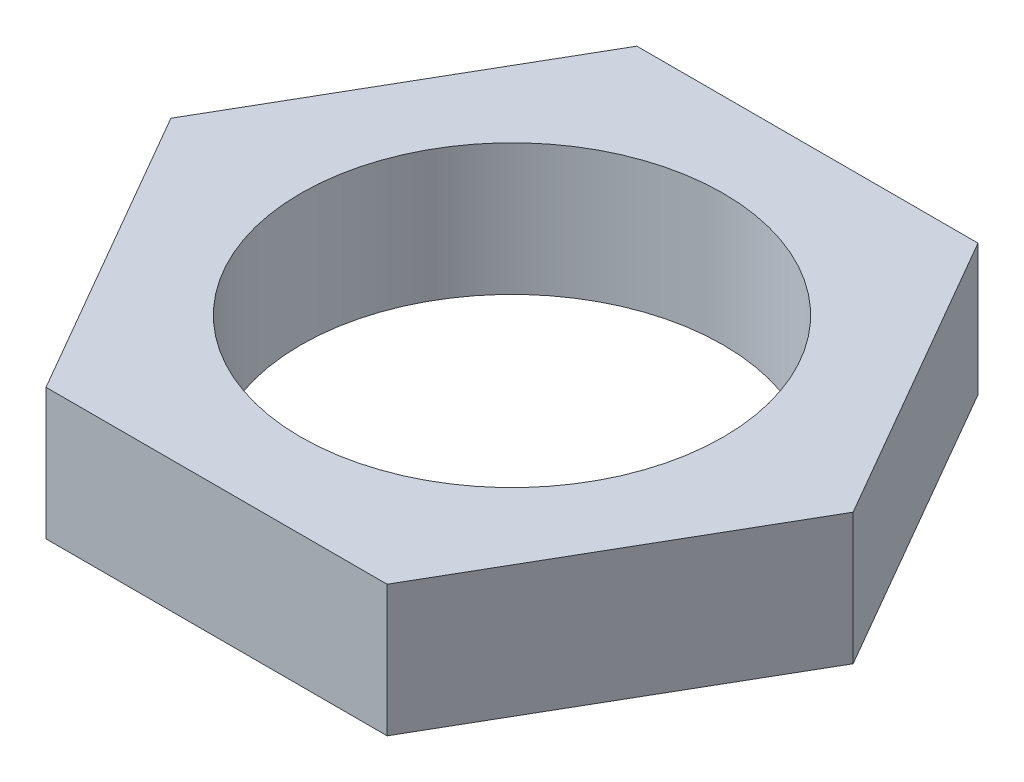
ISO-10303-21;
HEADER;
FILE_DESCRIPTION(('STEP AP214'),'2;1');
FILE_NAME('part.step','',(''),(''),'','','');
FILE_SCHEMA(('AUTOMOTIVE_DESIGN { 1 0 10303 214 1 1 1 1 }'));
ENDSEC;
DATA;
#1=APPLICATION_CONTEXT('core data for automotive mechanical design processes');
#2=APPLICATION_PROTOCOL_DEFINITION('international standard','automotive_design',2000,#1);
#3=PRODUCT_CONTEXT('',#1,'mechanical');
#4=PRODUCT('Part','Part','',(#3));
#5=PRODUCT_RELATED_PRODUCT_CATEGORY('part','',(#4));
#6=PRODUCT_DEFINITION_FORMATION('','',#4);
#7=PRODUCT_DEFINITION_CONTEXT('part definition',#1,'design');
#8=PRODUCT_DEFINITION('design','',#6,#7);
#9=PRODUCT_DEFINITION_SHAPE('','',#8);
#10=(LENGTH_UNIT() NAMED_UNIT(*) SI_UNIT(.MILLI.,.METRE.));
#11=(NAMED_UNIT(*) PLANE_ANGLE_UNIT() SI_UNIT($,.RADIAN.));
#12=(NAMED_UNIT(*) SI_UNIT($,.STERADIAN.) SOLID_ANGLE_UNIT());
#13=UNCERTAINTY_MEASURE_WITH_UNIT(LENGTH_MEASURE(1.E-05),#10,'distance_accuracy_value','');
#14=(GEOMETRIC_REPRESENTATION_CONTEXT(3) GLOBAL_UNCERTAINTY_ASSIGNED_CONTEXT((#13)) GLOBAL_UNIT_ASSIGNED_CONTEXT((#10,
#11,#12)) REPRESENTATION_CONTEXT('',''));
#15=CARTESIAN_POINT('',(0.,0.,0.));
#16=DIRECTION('',(0.,0.,1.));
#17=DIRECTION('',(1.,0.,0.));
#18=AXIS2_PLACEMENT_3D('',#15,#16,#17);
#19=CARTESIAN_POINT('',(7.79422863405994,6.,13.5));
#20=DIRECTION('',(0.,1.,0.));
#21=DIRECTION('',(0.,0.,1.));
#22=AXIS2_PLACEMENT_3D('',#19,#20,#21);
#23=PLANE('',#22);
#24=DIRECTION('',(1.,0.,0.));
#25=VECTOR('',#24,1.);
#26=CARTESIAN_POINT('',(-7.79422863405994,6.,13.5));
#27=LINE('',#26,#25);
#28=CARTESIAN_POINT('',(-7.79422863405994,6.,13.5));
#29=VERTEX_POINT('',#28);
#30=CARTESIAN_POINT('',(7.79422863405994,6.,13.5));
#31=VERTEX_POINT('',#30);
#32=EDGE_CURVE('E127',#29,#31,#27,.T.);
#33=ORIENTED_EDGE('',*,*,#32,.T.);
#34=DIRECTION('',(0.5,0.,-0.866025403784439));
#35=VECTOR('',#34,1.);
#36=CARTESIAN_POINT('',(7.79422863405994,6.,13.5));
#37=LINE('',#36,#35);
#38=CARTESIAN_POINT('',(15.5884572681199,6.,0.));
#39=VERTEX_POINT('',#38);
#40=EDGE_CURVE('E85',#31,#39,#37,.T.);
#41=ORIENTED_EDGE('',*,*,#40,.T.);
#42=DIRECTION('',(-0.5,0.,-0.866025403784439));
#43=VECTOR('',#42,1.);
#44=CARTESIAN_POINT('',(15.5884572681199,6.,0.));
#45=LINE('',#44,#43);
#46=CARTESIAN_POINT('',(7.79422863405994,6.,-13.5));
#47=VERTEX_POINT('',#46);
#48=EDGE_CURVE('E98',#39,#47,#45,.T.);
#49=ORIENTED_EDGE('',*,*,#48,.T.);
#50=DIRECTION('',(-1.,0.,0.));
#51=VECTOR('',#50,1.);
#52=CARTESIAN_POINT('',(7.79422863405994,6.,-13.5));
#53=LINE('',#52,#51);
#54=CARTESIAN_POINT('',(-7.79422863405995,6.,-13.5));
#55=VERTEX_POINT('',#54);
#56=EDGE_CURVE('E92',#47,#55,#53,.T.);
#57=ORIENTED_EDGE('',*,*,#56,.T.);
#58=DIRECTION('',(-0.5,0.,0.866025403784439));
#59=VECTOR('',#58,1.);
#60=CARTESIAN_POINT('',(-7.79422863405995,6.,-13.5));
#61=LINE('',#60,#59);
#62=CARTESIAN_POINT('',(-15.5884572681199,6.,0.));
#63=VERTEX_POINT('',#62);
#64=EDGE_CURVE('E96',#55,#63,#61,.T.);
#65=ORIENTED_EDGE('',*,*,#64,.T.);
#66=DIRECTION('',(0.5,0.,0.866025403784439));
#67=VECTOR('',#66,1.);
#68=CARTESIAN_POINT('',(-15.5884572681199,6.,0.));
#69=LINE('',#68,#67);
#70=EDGE_CURVE('E48',#63,#29,#69,.T.);
#71=ORIENTED_EDGE('',*,*,#70,.T.);
#72=EDGE_LOOP('',(#33,#41,#49,#57,#65,#71));
#73=FACE_BOUND('',#72,.T.);
#74=CARTESIAN_POINT('',(0.,6.,0.));
#75=DIRECTION('',(0.,1.,0.));
#76=DIRECTION('',(0.,0.,1.));
#77=AXIS2_PLACEMENT_3D('',#74,#75,#76);
#78=CIRCLE('',#77,9.65);
#79=CARTESIAN_POINT('',(0.,6.,9.65));
#80=VERTEX_POINT('',#79);
#81=EDGE_CURVE('E120',#80,#80,#78,.T.);
#82=ORIENTED_EDGE('',*,*,#81,.F.);
#83=EDGE_LOOP('',(#82));
#84=FACE_BOUND('',#83,.T.);
#85=ADVANCED_FACE('F31',(#73,#84),#23,.T.);
#86=CARTESIAN_POINT('',(7.79422863405994,0.,13.5));
#87=DIRECTION('',(0.,1.,0.));
#88=DIRECTION('',(0.,0.,1.));
#89=AXIS2_PLACEMENT_3D('',#86,#87,#88);
#90=PLANE('',#89);
#91=DIRECTION('',(1.,0.,0.));
#92=VECTOR('',#91,1.);
#93=CARTESIAN_POINT('',(-7.79422863405994,0.,13.5));
#94=LINE('',#93,#92);
#95=CARTESIAN_POINT('',(-7.79422863405994,0.,13.5));
#96=VERTEX_POINT('',#95);
#97=CARTESIAN_POINT('',(7.79422863405994,0.,13.5));
#98=VERTEX_POINT('',#97);
#99=EDGE_CURVE('E116',#96,#98,#94,.T.);
#100=ORIENTED_EDGE('',*,*,#99,.F.);
#101=DIRECTION('',(0.5,0.,0.866025403784439));
#102=VECTOR('',#101,1.);
#103=CARTESIAN_POINT('',(-15.5884572681199,0.,0.));
#104=LINE('',#103,#102);
#105=CARTESIAN_POINT('',(-15.5884572681199,0.,0.));
#106=VERTEX_POINT('',#105);
#107=EDGE_CURVE('E77',#106,#96,#104,.T.);
#108=ORIENTED_EDGE('',*,*,#107,.F.);
#109=DIRECTION('',(-0.5,0.,0.866025403784439));
#110=VECTOR('',#109,1.);
#111=CARTESIAN_POINT('',(-7.79422863405995,0.,-13.5));
#112=LINE('',#111,#110);
#113=CARTESIAN_POINT('',(-7.79422863405995,0.,-13.5));
#114=VERTEX_POINT('',#113);
#115=EDGE_CURVE('E71',#114,#106,#112,.T.);
#116=ORIENTED_EDGE('',*,*,#115,.F.);
#117=DIRECTION('',(-1.,0.,0.));
#118=VECTOR('',#117,1.);
#119=CARTESIAN_POINT('',(7.79422863405994,0.,-13.5));
#120=LINE('',#119,#118);
#121=CARTESIAN_POINT('',(7.79422863405994,0.,-13.5));
#122=VERTEX_POINT('',#121);
#123=EDGE_CURVE('E106',#122,#114,#120,.T.);
#124=ORIENTED_EDGE('',*,*,#123,.F.);
#125=DIRECTION('',(-0.5,0.,-0.866025403784439));
#126=VECTOR('',#125,1.);
#127=CARTESIAN_POINT('',(15.5884572681199,0.,0.));
#128=LINE('',#127,#126);
#129=CARTESIAN_POINT('',(15.5884572681199,0.,0.));
#130=VERTEX_POINT('',#129);
#131=EDGE_CURVE('E122',#130,#122,#128,.T.);
#132=ORIENTED_EDGE('',*,*,#131,.F.);
#133=DIRECTION('',(0.5,0.,-0.866025403784439));
#134=VECTOR('',#133,1.);
#135=CARTESIAN_POINT('',(7.79422863405994,0.,13.5));
#136=LINE('',#135,#134);
#137=EDGE_CURVE('E119',#98,#130,#136,.T.);
#138=ORIENTED_EDGE('',*,*,#137,.F.);
#139=EDGE_LOOP('',(#100,#108,#116,#124,#132,#138));
#140=FACE_BOUND('',#139,.T.);
#141=CARTESIAN_POINT('',(0.,0.,0.));
#142=DIRECTION('',(0.,1.,0.));
#143=DIRECTION('',(0.,0.,1.));
#144=AXIS2_PLACEMENT_3D('',#141,#142,#143);
#145=CIRCLE('',#144,9.65);
#146=CARTESIAN_POINT('',(0.,0.,9.65));
#147=VERTEX_POINT('',#146);
#148=EDGE_CURVE('E220',#147,#147,#145,.T.);
#149=ORIENTED_EDGE('',*,*,#148,.T.);
#150=EDGE_LOOP('',(#149));
#151=FACE_BOUND('',#150,.T.);
#152=ADVANCED_FACE('F136',(#140,#151),#90,.F.);
#153=CARTESIAN_POINT('',(-7.79422863405994,6.,13.5));
#154=DIRECTION('',(0.,0.,-1.));
#155=DIRECTION('',(-1.,0.,0.));
#156=AXIS2_PLACEMENT_3D('',#153,#154,#155);
#157=PLANE('',#156);
#158=ORIENTED_EDGE('',*,*,#99,.T.);
#159=DIRECTION('',(0.,-1.,0.));
#160=VECTOR('',#159,1.);
#161=CARTESIAN_POINT('',(7.79422863405994,6.,13.5));
#162=LINE('',#161,#160);
#163=EDGE_CURVE('E11',#31,#98,#162,.T.);
#164=ORIENTED_EDGE('',*,*,#163,.F.);
#165=ORIENTED_EDGE('',*,*,#32,.F.);
#166=DIRECTION('',(0.,-1.,0.));
#167=VECTOR('',#166,1.);
#168=CARTESIAN_POINT('',(-7.79422863405994,6.,13.5));
#169=LINE('',#168,#167);
#170=EDGE_CURVE('E112',#29,#96,#169,.T.);
#171=ORIENTED_EDGE('',*,*,#170,.T.);
#172=EDGE_LOOP('',(#158,#164,#165,#171));
#173=FACE_BOUND('',#172,.T.);
#174=ADVANCED_FACE('F33',(#173),#157,.F.);
#175=CARTESIAN_POINT('',(7.79422863405994,6.,13.5));
#176=DIRECTION('',(-0.866025403784439,0.,-0.5));
#177=DIRECTION('',(-0.5,0.,0.866025403784439));
#178=AXIS2_PLACEMENT_3D('',#175,#176,#177);
#179=PLANE('',#178);
#180=ORIENTED_EDGE('',*,*,#137,.T.);
#181=DIRECTION('',(0.,-1.,0.));
#182=VECTOR('',#181,1.);
#183=CARTESIAN_POINT('',(15.5884572681199,6.,0.));
#184=LINE('',#183,#182);
#185=EDGE_CURVE('E40',#39,#130,#184,.T.);
#186=ORIENTED_EDGE('',*,*,#185,.F.);
#187=ORIENTED_EDGE('',*,*,#40,.F.);
#188=ORIENTED_EDGE('',*,*,#163,.T.);
#189=EDGE_LOOP('',(#180,#186,#187,#188));
#190=FACE_BOUND('',#189,.T.);
#191=ADVANCED_FACE('F161',(#190),#179,.F.);
#192=CARTESIAN_POINT('',(15.5884572681199,6.,0.));
#193=DIRECTION('',(-0.866025403784438,0.,0.5));
#194=DIRECTION('',(0.5,0.,0.866025403784439));
#195=AXIS2_PLACEMENT_3D('',#192,#193,#194);
#196=PLANE('',#195);
#197=ORIENTED_EDGE('',*,*,#131,.T.);
#198=DIRECTION('',(0.,-1.,0.));
#199=VECTOR('',#198,1.);
#200=CARTESIAN_POINT('',(7.79422863405994,6.,-13.5));
#201=LINE('',#200,#199);
#202=EDGE_CURVE('E107',#47,#122,#201,.T.);
#203=ORIENTED_EDGE('',*,*,#202,.F.);
#204=ORIENTED_EDGE('',*,*,#48,.F.);
#205=ORIENTED_EDGE('',*,*,#185,.T.);
#206=EDGE_LOOP('',(#197,#203,#204,#205));
#207=FACE_BOUND('',#206,.T.);
#208=ADVANCED_FACE('F133',(#207),#196,.F.);
#209=CARTESIAN_POINT('',(7.79422863405994,6.,-13.5));
#210=DIRECTION('',(0.,0.,1.));
#211=DIRECTION('',(1.,0.,0.));
#212=AXIS2_PLACEMENT_3D('',#209,#210,#211);
#213=PLANE('',#212);
#214=ORIENTED_EDGE('',*,*,#123,.T.);
#215=DIRECTION('',(0.,-1.,0.));
#216=VECTOR('',#215,1.);
#217=CARTESIAN_POINT('',(-7.79422863405995,6.,-13.5));
#218=LINE('',#217,#216);
#219=EDGE_CURVE('E103',#55,#114,#218,.T.);
#220=ORIENTED_EDGE('',*,*,#219,.F.);
#221=ORIENTED_EDGE('',*,*,#56,.F.);
#222=ORIENTED_EDGE('',*,*,#202,.T.);
#223=EDGE_LOOP('',(#214,#220,#221,#222));
#224=FACE_BOUND('',#223,.T.);
#225=ADVANCED_FACE('F104',(#224),#213,.F.);
#226=CARTESIAN_POINT('',(-7.79422863405995,6.,-13.5));
#227=DIRECTION('',(0.866025403784439,0.,0.5));
#228=DIRECTION('',(0.5,0.,-0.866025403784439));
#229=AXIS2_PLACEMENT_3D('',#226,#227,#228);
#230=PLANE('',#229);
#231=ORIENTED_EDGE('',*,*,#115,.T.);
#232=DIRECTION('',(0.,-1.,0.));
#233=VECTOR('',#232,1.);
#234=CARTESIAN_POINT('',(-15.5884572681199,6.,0.));
#235=LINE('',#234,#233);
#236=EDGE_CURVE('E108',#63,#106,#235,.T.);
#237=ORIENTED_EDGE('',*,*,#236,.F.);
#238=ORIENTED_EDGE('',*,*,#64,.F.);
#239=ORIENTED_EDGE('',*,*,#219,.T.);
#240=EDGE_LOOP('',(#231,#237,#238,#239));
#241=FACE_BOUND('',#240,.T.);
#242=ADVANCED_FACE('F110',(#241),#230,.F.);
#243=CARTESIAN_POINT('',(-15.5884572681199,6.,0.));
#244=DIRECTION('',(0.866025403784439,0.,-0.5));
#245=DIRECTION('',(-0.5,0.,-0.866025403784439));
#246=AXIS2_PLACEMENT_3D('',#243,#244,#245);
#247=PLANE('',#246);
#248=ORIENTED_EDGE('',*,*,#107,.T.);
#249=ORIENTED_EDGE('',*,*,#170,.F.);
#250=ORIENTED_EDGE('',*,*,#70,.F.);
#251=ORIENTED_EDGE('',*,*,#236,.T.);
#252=EDGE_LOOP('',(#248,#249,#250,#251));
#253=FACE_BOUND('',#252,.T.);
#254=ADVANCED_FACE('F141',(#253),#247,.F.);
#255=CARTESIAN_POINT('',(0.,6.,0.));
#256=DIRECTION('',(0.,-1.,0.));
#257=DIRECTION('',(0.,0.,-1.));
#258=AXIS2_PLACEMENT_3D('',#255,#256,#257);
#259=CYLINDRICAL_SURFACE('',#258,9.65);
#260=ORIENTED_EDGE('',*,*,#81,.T.);
#261=EDGE_LOOP('',(#260));
#262=FACE_BOUND('',#261,.T.);
#263=ORIENTED_EDGE('',*,*,#148,.F.);
#264=EDGE_LOOP('',(#263));
#265=FACE_BOUND('',#264,.T.);
#266=ADVANCED_FACE('F143',(#262,#265),#259,.F.);
#267=CLOSED_SHELL('',(#85,#152,#174,#191,#208,#225,#242,#254,#266));
#268=MANIFOLD_SOLID_BREP('B2',#267);
#269=ADVANCED_BREP_SHAPE_REPRESENTATION('',(#18,#268),#14);
#270=SHAPE_DEFINITION_REPRESENTATION(#9,#269);
ENDSEC;
END-ISO-10303-21;
